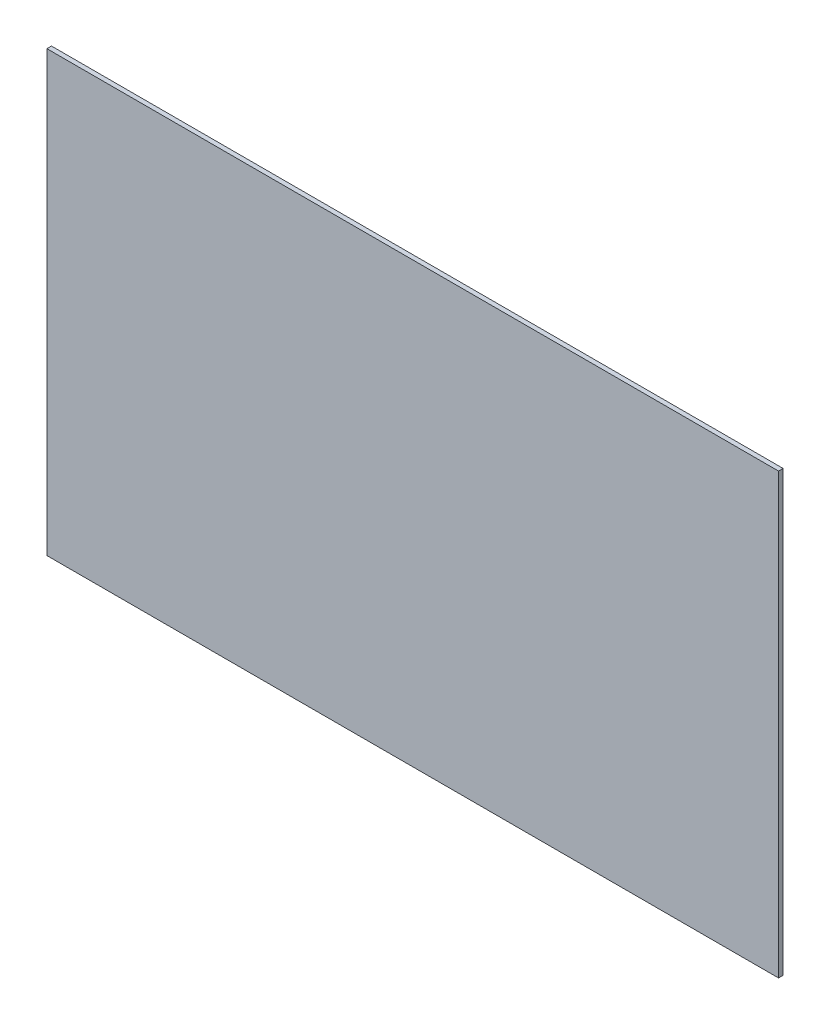
ISO-10303-21;
HEADER;
FILE_DESCRIPTION(('STEP AP214'),'2;1');
FILE_NAME('part.step','',(''),(''),'','','');
FILE_SCHEMA(('AUTOMOTIVE_DESIGN { 1 0 10303 214 1 1 1 1 }'));
ENDSEC;
DATA;
#1=APPLICATION_CONTEXT('core data for automotive mechanical design processes');
#2=APPLICATION_PROTOCOL_DEFINITION('international standard','automotive_design',2000,#1);
#3=PRODUCT_CONTEXT('',#1,'mechanical');
#4=PRODUCT('Part','Part','',(#3));
#5=PRODUCT_RELATED_PRODUCT_CATEGORY('part','',(#4));
#6=PRODUCT_DEFINITION_FORMATION('','',#4);
#7=PRODUCT_DEFINITION_CONTEXT('part definition',#1,'design');
#8=PRODUCT_DEFINITION('design','',#6,#7);
#9=PRODUCT_DEFINITION_SHAPE('','',#8);
#10=(LENGTH_UNIT() NAMED_UNIT(*) SI_UNIT(.MILLI.,.METRE.));
#11=(NAMED_UNIT(*) PLANE_ANGLE_UNIT() SI_UNIT($,.RADIAN.));
#12=(NAMED_UNIT(*) SI_UNIT($,.STERADIAN.) SOLID_ANGLE_UNIT());
#13=UNCERTAINTY_MEASURE_WITH_UNIT(LENGTH_MEASURE(1.E-05),#10,'distance_accuracy_value','');
#14=(GEOMETRIC_REPRESENTATION_CONTEXT(3) GLOBAL_UNCERTAINTY_ASSIGNED_CONTEXT((#13)) GLOBAL_UNIT_ASSIGNED_CONTEXT((#10,
#11,#12)) REPRESENTATION_CONTEXT('',''));
#15=CARTESIAN_POINT('',(0.,0.,0.));
#16=DIRECTION('',(0.,0.,1.));
#17=DIRECTION('',(1.,0.,0.));
#18=AXIS2_PLACEMENT_3D('',#15,#16,#17);
#19=CARTESIAN_POINT('',(254.,-152.4,1.5875));
#20=DIRECTION('',(-1.,0.,0.));
#21=DIRECTION('',(0.,0.,1.));
#22=AXIS2_PLACEMENT_3D('',#19,#20,#21);
#23=PLANE('',#22);
#24=DIRECTION('',(0.,1.,0.));
#25=VECTOR('',#24,1.);
#26=CARTESIAN_POINT('',(254.,-152.4,-1.5875));
#27=LINE('',#26,#25);
#28=CARTESIAN_POINT('',(254.,-152.4,-1.5875));
#29=VERTEX_POINT('',#28);
#30=CARTESIAN_POINT('',(254.,152.4,-1.5875));
#31=VERTEX_POINT('',#30);
#32=EDGE_CURVE('E96',#29,#31,#27,.T.);
#33=ORIENTED_EDGE('',*,*,#32,.T.);
#34=DIRECTION('',(0.,0.,-1.));
#35=VECTOR('',#34,1.);
#36=CARTESIAN_POINT('',(254.,152.4,1.5875));
#37=LINE('',#36,#35);
#38=CARTESIAN_POINT('',(254.,152.4,1.5875));
#39=VERTEX_POINT('',#38);
#40=EDGE_CURVE('E11',#39,#31,#37,.T.);
#41=ORIENTED_EDGE('',*,*,#40,.F.);
#42=DIRECTION('',(0.,1.,0.));
#43=VECTOR('',#42,1.);
#44=CARTESIAN_POINT('',(254.,-152.4,1.5875));
#45=LINE('',#44,#43);
#46=CARTESIAN_POINT('',(254.,-152.4,1.5875));
#47=VERTEX_POINT('',#46);
#48=EDGE_CURVE('E84',#47,#39,#45,.T.);
#49=ORIENTED_EDGE('',*,*,#48,.F.);
#50=DIRECTION('',(0.,0.,-1.));
#51=VECTOR('',#50,1.);
#52=CARTESIAN_POINT('',(254.,-152.4,1.5875));
#53=LINE('',#52,#51);
#54=EDGE_CURVE('E92',#47,#29,#53,.T.);
#55=ORIENTED_EDGE('',*,*,#54,.T.);
#56=EDGE_LOOP('',(#33,#41,#49,#55));
#57=FACE_BOUND('',#56,.T.);
#58=ADVANCED_FACE('F33',(#57),#23,.F.);
#59=CARTESIAN_POINT('',(-254.,152.4,1.5875));
#60=DIRECTION('',(0.,-1.,0.));
#61=DIRECTION('',(0.,0.,-1.));
#62=AXIS2_PLACEMENT_3D('',#59,#60,#61);
#63=PLANE('',#62);
#64=DIRECTION('',(-1.,0.,0.));
#65=VECTOR('',#64,1.);
#66=CARTESIAN_POINT('',(-254.,152.4,-1.5875));
#67=LINE('',#66,#65);
#68=CARTESIAN_POINT('',(-254.,152.4,-1.5875));
#69=VERTEX_POINT('',#68);
#70=EDGE_CURVE('E88',#31,#69,#67,.T.);
#71=ORIENTED_EDGE('',*,*,#70,.T.);
#72=DIRECTION('',(0.,0.,-1.));
#73=VECTOR('',#72,1.);
#74=CARTESIAN_POINT('',(-254.,152.4,1.5875));
#75=LINE('',#74,#73);
#76=CARTESIAN_POINT('',(-254.,152.4,1.5875));
#77=VERTEX_POINT('',#76);
#78=EDGE_CURVE('E41',#77,#69,#75,.T.);
#79=ORIENTED_EDGE('',*,*,#78,.F.);
#80=DIRECTION('',(-1.,0.,0.));
#81=VECTOR('',#80,1.);
#82=CARTESIAN_POINT('',(-254.,152.4,1.5875));
#83=LINE('',#82,#81);
#84=EDGE_CURVE('E79',#39,#77,#83,.T.);
#85=ORIENTED_EDGE('',*,*,#84,.F.);
#86=ORIENTED_EDGE('',*,*,#40,.T.);
#87=EDGE_LOOP('',(#71,#79,#85,#86));
#88=FACE_BOUND('',#87,.T.);
#89=ADVANCED_FACE('F87',(#88),#63,.F.);
#90=CARTESIAN_POINT('',(-254.,-152.4,1.5875));
#91=DIRECTION('',(1.,0.,0.));
#92=DIRECTION('',(0.,0.,-1.));
#93=AXIS2_PLACEMENT_3D('',#90,#91,#92);
#94=PLANE('',#93);
#95=DIRECTION('',(0.,-1.,0.));
#96=VECTOR('',#95,1.);
#97=CARTESIAN_POINT('',(-254.,-152.4,-1.5875));
#98=LINE('',#97,#96);
#99=CARTESIAN_POINT('',(-254.,-152.4,-1.5875));
#100=VERTEX_POINT('',#99);
#101=EDGE_CURVE('E66',#69,#100,#98,.T.);
#102=ORIENTED_EDGE('',*,*,#101,.T.);
#103=DIRECTION('',(0.,0.,-1.));
#104=VECTOR('',#103,1.);
#105=CARTESIAN_POINT('',(-254.,-152.4,1.5875));
#106=LINE('',#105,#104);
#107=CARTESIAN_POINT('',(-254.,-152.4,1.5875));
#108=VERTEX_POINT('',#107);
#109=EDGE_CURVE('E89',#108,#100,#106,.T.);
#110=ORIENTED_EDGE('',*,*,#109,.F.);
#111=DIRECTION('',(0.,-1.,0.));
#112=VECTOR('',#111,1.);
#113=CARTESIAN_POINT('',(-254.,-152.4,1.5875));
#114=LINE('',#113,#112);
#115=EDGE_CURVE('E82',#77,#108,#114,.T.);
#116=ORIENTED_EDGE('',*,*,#115,.F.);
#117=ORIENTED_EDGE('',*,*,#78,.T.);
#118=EDGE_LOOP('',(#102,#110,#116,#117));
#119=FACE_BOUND('',#118,.T.);
#120=ADVANCED_FACE('F90',(#119),#94,.F.);
#121=CARTESIAN_POINT('',(-254.,-152.4,1.5875));
#122=DIRECTION('',(0.,1.,0.));
#123=DIRECTION('',(0.,0.,1.));
#124=AXIS2_PLACEMENT_3D('',#121,#122,#123);
#125=PLANE('',#124);
#126=DIRECTION('',(1.,0.,0.));
#127=VECTOR('',#126,1.);
#128=CARTESIAN_POINT('',(-254.,-152.4,-1.5875));
#129=LINE('',#128,#127);
#130=EDGE_CURVE('E72',#100,#29,#129,.T.);
#131=ORIENTED_EDGE('',*,*,#130,.T.);
#132=ORIENTED_EDGE('',*,*,#54,.F.);
#133=DIRECTION('',(1.,0.,0.));
#134=VECTOR('',#133,1.);
#135=CARTESIAN_POINT('',(-254.,-152.4,1.5875));
#136=LINE('',#135,#134);
#137=EDGE_CURVE('E49',#108,#47,#136,.T.);
#138=ORIENTED_EDGE('',*,*,#137,.F.);
#139=ORIENTED_EDGE('',*,*,#109,.T.);
#140=EDGE_LOOP('',(#131,#132,#138,#139));
#141=FACE_BOUND('',#140,.T.);
#142=ADVANCED_FACE('F103',(#141),#125,.F.);
#143=CARTESIAN_POINT('',(0.,0.,1.5875));
#144=DIRECTION('',(0.,0.,-1.));
#145=DIRECTION('',(-1.,0.,0.));
#146=AXIS2_PLACEMENT_3D('',#143,#144,#145);
#147=PLANE('',#146);
#148=ORIENTED_EDGE('',*,*,#48,.T.);
#149=ORIENTED_EDGE('',*,*,#84,.T.);
#150=ORIENTED_EDGE('',*,*,#115,.T.);
#151=ORIENTED_EDGE('',*,*,#137,.T.);
#152=EDGE_LOOP('',(#148,#149,#150,#151));
#153=FACE_BOUND('',#152,.T.);
#154=ADVANCED_FACE('F80',(#153),#147,.F.);
#155=CARTESIAN_POINT('',(0.,0.,-1.5875));
#156=DIRECTION('',(0.,0.,-1.));
#157=DIRECTION('',(-1.,0.,0.));
#158=AXIS2_PLACEMENT_3D('',#155,#156,#157);
#159=PLANE('',#158);
#160=ORIENTED_EDGE('',*,*,#32,.F.);
#161=ORIENTED_EDGE('',*,*,#130,.F.);
#162=ORIENTED_EDGE('',*,*,#101,.F.);
#163=ORIENTED_EDGE('',*,*,#70,.F.);
#164=EDGE_LOOP('',(#160,#161,#162,#163));
#165=FACE_BOUND('',#164,.T.);
#166=ADVANCED_FACE('F106',(#165),#159,.T.);
#167=CLOSED_SHELL('',(#58,#89,#120,#142,#154,#166));
#168=MANIFOLD_SOLID_BREP('B2',#167);
#169=ADVANCED_BREP_SHAPE_REPRESENTATION('',(#18,#168),#14);
#170=SHAPE_DEFINITION_REPRESENTATION(#9,#169);
ENDSEC;
END-ISO-10303-21;
